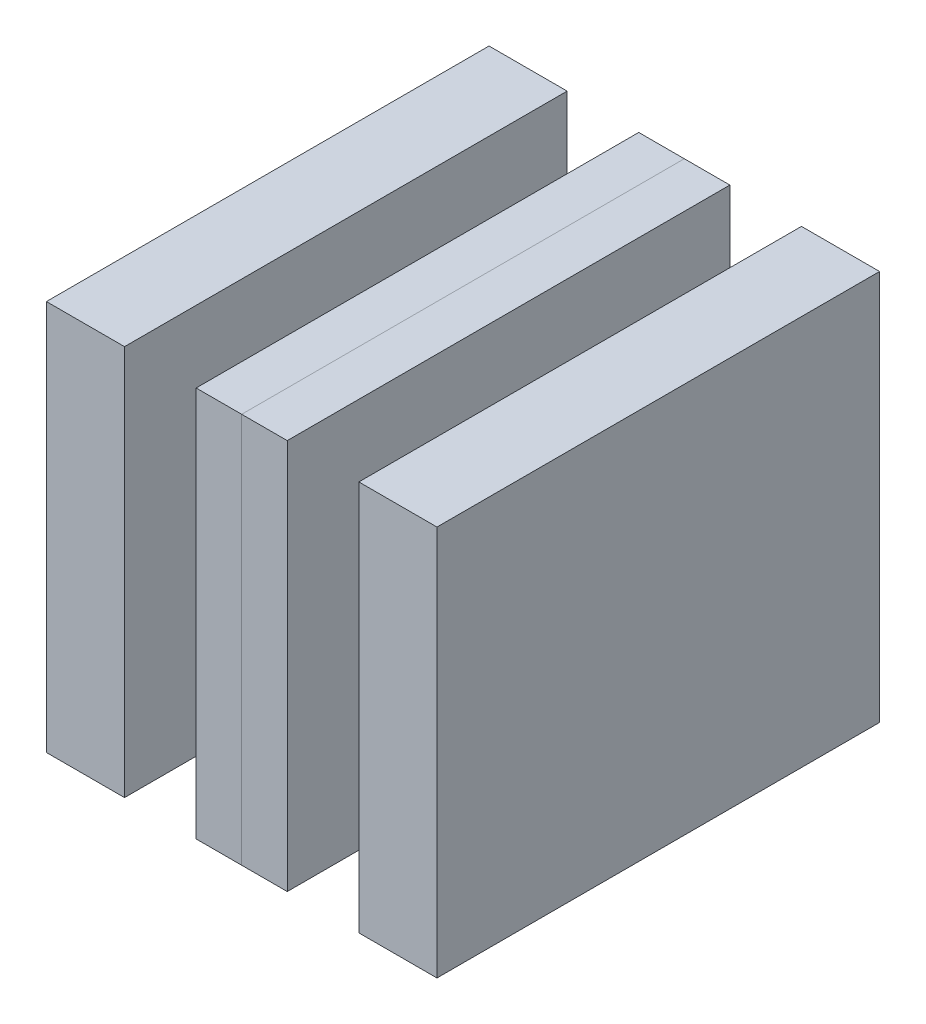
ISO-10303-21;
HEADER;
FILE_DESCRIPTION(('STEP AP214'),'2;1');
FILE_NAME('part.step','',(''),(''),'','','');
FILE_SCHEMA(('AUTOMOTIVE_DESIGN { 1 0 10303 214 1 1 1 1 }'));
ENDSEC;
DATA;
#1=APPLICATION_CONTEXT('core data for automotive mechanical design processes');
#2=APPLICATION_PROTOCOL_DEFINITION('international standard','automotive_design',2000,#1);
#3=PRODUCT_CONTEXT('',#1,'mechanical');
#4=PRODUCT('Part','Part','',(#3));
#5=PRODUCT_RELATED_PRODUCT_CATEGORY('part','',(#4));
#6=PRODUCT_DEFINITION_FORMATION('','',#4);
#7=PRODUCT_DEFINITION_CONTEXT('part definition',#1,'design');
#8=PRODUCT_DEFINITION('design','',#6,#7);
#9=PRODUCT_DEFINITION_SHAPE('','',#8);
#10=(LENGTH_UNIT() NAMED_UNIT(*) SI_UNIT(.MILLI.,.METRE.));
#11=(NAMED_UNIT(*) PLANE_ANGLE_UNIT() SI_UNIT($,.RADIAN.));
#12=(NAMED_UNIT(*) SI_UNIT($,.STERADIAN.) SOLID_ANGLE_UNIT());
#13=UNCERTAINTY_MEASURE_WITH_UNIT(LENGTH_MEASURE(1.E-05),#10,'distance_accuracy_value','');
#14=(GEOMETRIC_REPRESENTATION_CONTEXT(3) GLOBAL_UNCERTAINTY_ASSIGNED_CONTEXT((#13)) GLOBAL_UNIT_ASSIGNED_CONTEXT((#10,
#11,#12)) REPRESENTATION_CONTEXT('',''));
#15=CARTESIAN_POINT('',(0.,0.,0.));
#16=DIRECTION('',(0.,0.,1.));
#17=DIRECTION('',(1.,0.,0.));
#18=AXIS2_PLACEMENT_3D('',#15,#16,#17);
#19=CARTESIAN_POINT('',(15.,0.,17.));
#20=DIRECTION('',(-1.,0.,0.));
#21=DIRECTION('',(0.,0.,-1.));
#22=AXIS2_PLACEMENT_3D('',#19,#20,#21);
#23=PLANE('',#22);
#24=DIRECTION('',(0.,-1.,0.));
#25=VECTOR('',#24,1.);
#26=CARTESIAN_POINT('',(15.,0.,0.));
#27=LINE('',#26,#25);
#28=CARTESIAN_POINT('',(15.,15.,0.));
#29=VERTEX_POINT('',#28);
#30=CARTESIAN_POINT('',(15.,0.,0.));
#31=VERTEX_POINT('',#30);
#32=EDGE_CURVE('E107',#29,#31,#27,.T.);
#33=ORIENTED_EDGE('',*,*,#32,.F.);
#34=DIRECTION('',(0.,0.,-1.));
#35=VECTOR('',#34,1.);
#36=CARTESIAN_POINT('',(15.,15.,17.));
#37=LINE('',#36,#35);
#38=CARTESIAN_POINT('',(15.,15.,17.));
#39=VERTEX_POINT('',#38);
#40=EDGE_CURVE('E106',#39,#29,#37,.T.);
#41=ORIENTED_EDGE('',*,*,#40,.F.);
#42=DIRECTION('',(0.,-1.,0.));
#43=VECTOR('',#42,1.);
#44=CARTESIAN_POINT('',(15.,0.,17.));
#45=LINE('',#44,#43);
#46=CARTESIAN_POINT('',(15.,0.,17.));
#47=VERTEX_POINT('',#46);
#48=EDGE_CURVE('E101',#39,#47,#45,.T.);
#49=ORIENTED_EDGE('',*,*,#48,.T.);
#50=DIRECTION('',(0.,0.,-1.));
#51=VECTOR('',#50,1.);
#52=CARTESIAN_POINT('',(15.,0.,17.));
#53=LINE('',#52,#51);
#54=EDGE_CURVE('E12',#47,#31,#53,.T.);
#55=ORIENTED_EDGE('',*,*,#54,.T.);
#56=EDGE_LOOP('',(#33,#41,#49,#55));
#57=FACE_BOUND('',#56,.T.);
#58=ADVANCED_FACE('F44',(#57),#23,.F.);
#59=CARTESIAN_POINT('',(15.,0.,17.));
#60=DIRECTION('',(0.,1.,0.));
#61=DIRECTION('',(0.,0.,1.));
#62=AXIS2_PLACEMENT_3D('',#59,#60,#61);
#63=PLANE('',#62);
#64=DIRECTION('',(-1.,0.,0.));
#65=VECTOR('',#64,1.);
#66=CARTESIAN_POINT('',(15.,0.,0.));
#67=LINE('',#66,#65);
#68=CARTESIAN_POINT('',(12.,0.,0.));
#69=VERTEX_POINT('',#68);
#70=EDGE_CURVE('E109',#31,#69,#67,.T.);
#71=ORIENTED_EDGE('',*,*,#70,.F.);
#72=ORIENTED_EDGE('',*,*,#54,.F.);
#73=DIRECTION('',(-1.,0.,0.));
#74=VECTOR('',#73,1.);
#75=CARTESIAN_POINT('',(15.,0.,17.));
#76=LINE('',#75,#74);
#77=CARTESIAN_POINT('',(12.,0.,17.));
#78=VERTEX_POINT('',#77);
#79=EDGE_CURVE('E85',#47,#78,#76,.T.);
#80=ORIENTED_EDGE('',*,*,#79,.T.);
#81=DIRECTION('',(0.,0.,-1.));
#82=VECTOR('',#81,1.);
#83=CARTESIAN_POINT('',(12.,0.,17.));
#84=LINE('',#83,#82);
#85=EDGE_CURVE('E52',#78,#69,#84,.T.);
#86=ORIENTED_EDGE('',*,*,#85,.T.);
#87=EDGE_LOOP('',(#71,#72,#80,#86));
#88=FACE_BOUND('',#87,.T.);
#89=ADVANCED_FACE('F99',(#88),#63,.F.);
#90=CARTESIAN_POINT('',(12.,0.,17.));
#91=DIRECTION('',(1.,0.,0.));
#92=DIRECTION('',(0.,0.,1.));
#93=AXIS2_PLACEMENT_3D('',#90,#91,#92);
#94=PLANE('',#93);
#95=DIRECTION('',(0.,1.,0.));
#96=VECTOR('',#95,1.);
#97=CARTESIAN_POINT('',(12.,0.,0.));
#98=LINE('',#97,#96);
#99=CARTESIAN_POINT('',(12.,15.,0.));
#100=VERTEX_POINT('',#99);
#101=EDGE_CURVE('E95',#69,#100,#98,.T.);
#102=ORIENTED_EDGE('',*,*,#101,.F.);
#103=ORIENTED_EDGE('',*,*,#85,.F.);
#104=DIRECTION('',(0.,1.,0.));
#105=VECTOR('',#104,1.);
#106=CARTESIAN_POINT('',(12.,0.,17.));
#107=LINE('',#106,#105);
#108=CARTESIAN_POINT('',(12.,15.,17.));
#109=VERTEX_POINT('',#108);
#110=EDGE_CURVE('E88',#78,#109,#107,.T.);
#111=ORIENTED_EDGE('',*,*,#110,.T.);
#112=DIRECTION('',(0.,0.,-1.));
#113=VECTOR('',#112,1.);
#114=CARTESIAN_POINT('',(12.,15.,17.));
#115=LINE('',#114,#113);
#116=EDGE_CURVE('E98',#109,#100,#115,.T.);
#117=ORIENTED_EDGE('',*,*,#116,.T.);
#118=EDGE_LOOP('',(#102,#103,#111,#117));
#119=FACE_BOUND('',#118,.T.);
#120=ADVANCED_FACE('F94',(#119),#94,.F.);
#121=CARTESIAN_POINT('',(15.,15.,17.));
#122=DIRECTION('',(0.,-1.,0.));
#123=DIRECTION('',(0.,0.,-1.));
#124=AXIS2_PLACEMENT_3D('',#121,#122,#123);
#125=PLANE('',#124);
#126=DIRECTION('',(1.,0.,0.));
#127=VECTOR('',#126,1.);
#128=CARTESIAN_POINT('',(15.,15.,0.));
#129=LINE('',#128,#127);
#130=EDGE_CURVE('E74',#100,#29,#129,.T.);
#131=ORIENTED_EDGE('',*,*,#130,.F.);
#132=ORIENTED_EDGE('',*,*,#116,.F.);
#133=DIRECTION('',(1.,0.,0.));
#134=VECTOR('',#133,1.);
#135=CARTESIAN_POINT('',(15.,15.,17.));
#136=LINE('',#135,#134);
#137=EDGE_CURVE('E60',#109,#39,#136,.T.);
#138=ORIENTED_EDGE('',*,*,#137,.T.);
#139=ORIENTED_EDGE('',*,*,#40,.T.);
#140=EDGE_LOOP('',(#131,#132,#138,#139));
#141=FACE_BOUND('',#140,.T.);
#142=ADVANCED_FACE('F118',(#141),#125,.F.);
#143=CARTESIAN_POINT('',(15.,0.,17.));
#144=DIRECTION('',(0.,0.,-1.));
#145=DIRECTION('',(1.,0.,0.));
#146=AXIS2_PLACEMENT_3D('',#143,#144,#145);
#147=PLANE('',#146);
#148=ORIENTED_EDGE('',*,*,#48,.F.);
#149=ORIENTED_EDGE('',*,*,#137,.F.);
#150=ORIENTED_EDGE('',*,*,#110,.F.);
#151=ORIENTED_EDGE('',*,*,#79,.F.);
#152=EDGE_LOOP('',(#148,#149,#150,#151));
#153=FACE_BOUND('',#152,.T.);
#154=ADVANCED_FACE('F90',(#153),#147,.F.);
#155=CARTESIAN_POINT('',(15.,0.,0.));
#156=DIRECTION('',(0.,0.,-1.));
#157=DIRECTION('',(1.,0.,0.));
#158=AXIS2_PLACEMENT_3D('',#155,#156,#157);
#159=PLANE('',#158);
#160=ORIENTED_EDGE('',*,*,#32,.T.);
#161=ORIENTED_EDGE('',*,*,#70,.T.);
#162=ORIENTED_EDGE('',*,*,#101,.T.);
#163=ORIENTED_EDGE('',*,*,#130,.T.);
#164=EDGE_LOOP('',(#160,#161,#162,#163));
#165=FACE_BOUND('',#164,.T.);
#166=ADVANCED_FACE('F114',(#165),#159,.T.);
#167=CLOSED_SHELL('',(#58,#89,#120,#142,#154,#166));
#168=MANIFOLD_SOLID_BREP('B2',#167);
#169=CARTESIAN_POINT('',(9.25,15.,17.));
#170=DIRECTION('',(-1.,0.,0.));
#171=DIRECTION('',(0.,1.,0.));
#172=AXIS2_PLACEMENT_3D('',#169,#170,#171);
#173=PLANE('',#172);
#174=DIRECTION('',(0.,-1.,0.));
#175=VECTOR('',#174,1.);
#176=CARTESIAN_POINT('',(9.25,15.,0.));
#177=LINE('',#176,#175);
#178=CARTESIAN_POINT('',(9.25,15.,0.));
#179=VERTEX_POINT('',#178);
#180=CARTESIAN_POINT('',(9.25,0.,0.));
#181=VERTEX_POINT('',#180);
#182=EDGE_CURVE('E241',#179,#181,#177,.T.);
#183=ORIENTED_EDGE('',*,*,#182,.F.);
#184=DIRECTION('',(0.,0.,-1.));
#185=VECTOR('',#184,1.);
#186=CARTESIAN_POINT('',(9.25,15.,17.));
#187=LINE('',#186,#185);
#188=CARTESIAN_POINT('',(9.25,15.,17.));
#189=VERTEX_POINT('',#188);
#190=EDGE_CURVE('E240',#189,#179,#187,.T.);
#191=ORIENTED_EDGE('',*,*,#190,.F.);
#192=DIRECTION('',(0.,-1.,0.));
#193=VECTOR('',#192,1.);
#194=CARTESIAN_POINT('',(9.25,15.,17.));
#195=LINE('',#194,#193);
#196=CARTESIAN_POINT('',(9.25,0.,17.));
#197=VERTEX_POINT('',#196);
#198=EDGE_CURVE('E235',#189,#197,#195,.T.);
#199=ORIENTED_EDGE('',*,*,#198,.T.);
#200=DIRECTION('',(0.,0.,-1.));
#201=VECTOR('',#200,1.);
#202=CARTESIAN_POINT('',(9.25,0.,17.));
#203=LINE('',#202,#201);
#204=EDGE_CURVE('E42',#197,#181,#203,.T.);
#205=ORIENTED_EDGE('',*,*,#204,.T.);
#206=EDGE_LOOP('',(#183,#191,#199,#205));
#207=FACE_BOUND('',#206,.T.);
#208=ADVANCED_FACE('F178',(#207),#173,.F.);
#209=CARTESIAN_POINT('',(9.25,0.,17.));
#210=DIRECTION('',(0.,1.,0.));
#211=DIRECTION('',(0.,0.,1.));
#212=AXIS2_PLACEMENT_3D('',#209,#210,#211);
#213=PLANE('',#212);
#214=DIRECTION('',(-1.,0.,0.));
#215=VECTOR('',#214,1.);
#216=CARTESIAN_POINT('',(9.25,0.,0.));
#217=LINE('',#216,#215);
#218=CARTESIAN_POINT('',(7.5,0.,0.));
#219=VERTEX_POINT('',#218);
#220=EDGE_CURVE('E243',#181,#219,#217,.T.);
#221=ORIENTED_EDGE('',*,*,#220,.F.);
#222=ORIENTED_EDGE('',*,*,#204,.F.);
#223=DIRECTION('',(-1.,0.,0.));
#224=VECTOR('',#223,1.);
#225=CARTESIAN_POINT('',(9.25,0.,17.));
#226=LINE('',#225,#224);
#227=CARTESIAN_POINT('',(7.5,0.,17.));
#228=VERTEX_POINT('',#227);
#229=EDGE_CURVE('E219',#197,#228,#226,.T.);
#230=ORIENTED_EDGE('',*,*,#229,.T.);
#231=DIRECTION('',(0.,0.,-1.));
#232=VECTOR('',#231,1.);
#233=CARTESIAN_POINT('',(7.5,0.,17.));
#234=LINE('',#233,#232);
#235=EDGE_CURVE('E186',#228,#219,#234,.T.);
#236=ORIENTED_EDGE('',*,*,#235,.T.);
#237=EDGE_LOOP('',(#221,#222,#230,#236));
#238=FACE_BOUND('',#237,.T.);
#239=ADVANCED_FACE('F233',(#238),#213,.F.);
#240=CARTESIAN_POINT('',(7.5,15.,17.));
#241=DIRECTION('',(1.,0.,0.));
#242=DIRECTION('',(0.,-1.,0.));
#243=AXIS2_PLACEMENT_3D('',#240,#241,#242);
#244=PLANE('',#243);
#245=DIRECTION('',(0.,1.,0.));
#246=VECTOR('',#245,1.);
#247=CARTESIAN_POINT('',(7.5,15.,0.));
#248=LINE('',#247,#246);
#249=CARTESIAN_POINT('',(7.5,15.,0.));
#250=VERTEX_POINT('',#249);
#251=EDGE_CURVE('E229',#219,#250,#248,.T.);
#252=ORIENTED_EDGE('',*,*,#251,.F.);
#253=ORIENTED_EDGE('',*,*,#235,.F.);
#254=DIRECTION('',(0.,1.,0.));
#255=VECTOR('',#254,1.);
#256=CARTESIAN_POINT('',(7.5,15.,17.));
#257=LINE('',#256,#255);
#258=CARTESIAN_POINT('',(7.5,15.,17.));
#259=VERTEX_POINT('',#258);
#260=EDGE_CURVE('E222',#228,#259,#257,.T.);
#261=ORIENTED_EDGE('',*,*,#260,.T.);
#262=DIRECTION('',(0.,0.,-1.));
#263=VECTOR('',#262,1.);
#264=CARTESIAN_POINT('',(7.5,15.,17.));
#265=LINE('',#264,#263);
#266=EDGE_CURVE('E232',#259,#250,#265,.T.);
#267=ORIENTED_EDGE('',*,*,#266,.T.);
#268=EDGE_LOOP('',(#252,#253,#261,#267));
#269=FACE_BOUND('',#268,.T.);
#270=ADVANCED_FACE('F228',(#269),#244,.F.);
#271=CARTESIAN_POINT('',(9.25,15.,17.));
#272=DIRECTION('',(0.,-1.,0.));
#273=DIRECTION('',(0.,0.,-1.));
#274=AXIS2_PLACEMENT_3D('',#271,#272,#273);
#275=PLANE('',#274);
#276=DIRECTION('',(1.,0.,0.));
#277=VECTOR('',#276,1.);
#278=CARTESIAN_POINT('',(9.25,15.,0.));
#279=LINE('',#278,#277);
#280=EDGE_CURVE('E208',#250,#179,#279,.T.);
#281=ORIENTED_EDGE('',*,*,#280,.F.);
#282=ORIENTED_EDGE('',*,*,#266,.F.);
#283=DIRECTION('',(1.,0.,0.));
#284=VECTOR('',#283,1.);
#285=CARTESIAN_POINT('',(9.25,15.,17.));
#286=LINE('',#285,#284);
#287=EDGE_CURVE('E194',#259,#189,#286,.T.);
#288=ORIENTED_EDGE('',*,*,#287,.T.);
#289=ORIENTED_EDGE('',*,*,#190,.T.);
#290=EDGE_LOOP('',(#281,#282,#288,#289));
#291=FACE_BOUND('',#290,.T.);
#292=ADVANCED_FACE('F252',(#291),#275,.F.);
#293=CARTESIAN_POINT('',(15.,0.,17.));
#294=DIRECTION('',(0.,0.,1.));
#295=DIRECTION('',(-1.,0.,0.));
#296=AXIS2_PLACEMENT_3D('',#293,#294,#295);
#297=PLANE('',#296);
#298=ORIENTED_EDGE('',*,*,#198,.F.);
#299=ORIENTED_EDGE('',*,*,#287,.F.);
#300=ORIENTED_EDGE('',*,*,#260,.F.);
#301=ORIENTED_EDGE('',*,*,#229,.F.);
#302=EDGE_LOOP('',(#298,#299,#300,#301));
#303=FACE_BOUND('',#302,.T.);
#304=ADVANCED_FACE('F224',(#303),#297,.T.);
#305=CARTESIAN_POINT('',(15.,0.,0.));
#306=DIRECTION('',(0.,0.,1.));
#307=DIRECTION('',(-1.,0.,0.));
#308=AXIS2_PLACEMENT_3D('',#305,#306,#307);
#309=PLANE('',#308);
#310=ORIENTED_EDGE('',*,*,#182,.T.);
#311=ORIENTED_EDGE('',*,*,#220,.T.);
#312=ORIENTED_EDGE('',*,*,#251,.T.);
#313=ORIENTED_EDGE('',*,*,#280,.T.);
#314=EDGE_LOOP('',(#310,#311,#312,#313));
#315=FACE_BOUND('',#314,.T.);
#316=ADVANCED_FACE('F248',(#315),#309,.F.);
#317=CLOSED_SHELL('',(#208,#239,#270,#292,#304,#316));
#318=MANIFOLD_SOLID_BREP('B6',#317);
#319=CARTESIAN_POINT('',(5.75,15.,17.));
#320=DIRECTION('',(1.,0.,0.));
#321=DIRECTION('',(0.,1.,0.));
#322=AXIS2_PLACEMENT_3D('',#319,#320,#321);
#323=PLANE('',#322);
#324=DIRECTION('',(0.,-1.,0.));
#325=VECTOR('',#324,1.);
#326=CARTESIAN_POINT('',(5.75,15.,0.));
#327=LINE('',#326,#325);
#328=CARTESIAN_POINT('',(5.75,15.,0.));
#329=VERTEX_POINT('',#328);
#330=CARTESIAN_POINT('',(5.75,0.,0.));
#331=VERTEX_POINT('',#330);
#332=EDGE_CURVE('E374',#329,#331,#327,.T.);
#333=ORIENTED_EDGE('',*,*,#332,.T.);
#334=DIRECTION('',(0.,0.,-1.));
#335=VECTOR('',#334,1.);
#336=CARTESIAN_POINT('',(5.75,0.,17.));
#337=LINE('',#336,#335);
#338=CARTESIAN_POINT('',(5.75,0.,17.));
#339=VERTEX_POINT('',#338);
#340=EDGE_CURVE('E176',#339,#331,#337,.T.);
#341=ORIENTED_EDGE('',*,*,#340,.F.);
#342=DIRECTION('',(0.,-1.,0.));
#343=VECTOR('',#342,1.);
#344=CARTESIAN_POINT('',(5.75,15.,17.));
#345=LINE('',#344,#343);
#346=CARTESIAN_POINT('',(5.75,15.,17.));
#347=VERTEX_POINT('',#346);
#348=EDGE_CURVE('E362',#347,#339,#345,.T.);
#349=ORIENTED_EDGE('',*,*,#348,.F.);
#350=DIRECTION('',(0.,0.,-1.));
#351=VECTOR('',#350,1.);
#352=CARTESIAN_POINT('',(5.75,15.,17.));
#353=LINE('',#352,#351);
#354=EDGE_CURVE('E370',#347,#329,#353,.T.);
#355=ORIENTED_EDGE('',*,*,#354,.T.);
#356=EDGE_LOOP('',(#333,#341,#349,#355));
#357=FACE_BOUND('',#356,.T.);
#358=ADVANCED_FACE('F311',(#357),#323,.F.);
#359=CARTESIAN_POINT('',(5.75,0.,17.));
#360=DIRECTION('',(0.,1.,0.));
#361=DIRECTION('',(0.,0.,1.));
#362=AXIS2_PLACEMENT_3D('',#359,#360,#361);
#363=PLANE('',#362);
#364=DIRECTION('',(1.,0.,0.));
#365=VECTOR('',#364,1.);
#366=CARTESIAN_POINT('',(5.75,0.,0.));
#367=LINE('',#366,#365);
#368=CARTESIAN_POINT('',(7.5,0.,0.));
#369=VERTEX_POINT('',#368);
#370=EDGE_CURVE('E366',#331,#369,#367,.T.);
#371=ORIENTED_EDGE('',*,*,#370,.T.);
#372=DIRECTION('',(0.,0.,-1.));
#373=VECTOR('',#372,1.);
#374=CARTESIAN_POINT('',(7.5,0.,17.));
#375=LINE('',#374,#373);
#376=CARTESIAN_POINT('',(7.5,0.,17.));
#377=VERTEX_POINT('',#376);
#378=EDGE_CURVE('E319',#377,#369,#375,.T.);
#379=ORIENTED_EDGE('',*,*,#378,.F.);
#380=DIRECTION('',(1.,0.,0.));
#381=VECTOR('',#380,1.);
#382=CARTESIAN_POINT('',(5.75,0.,17.));
#383=LINE('',#382,#381);
#384=EDGE_CURVE('E357',#339,#377,#383,.T.);
#385=ORIENTED_EDGE('',*,*,#384,.F.);
#386=ORIENTED_EDGE('',*,*,#340,.T.);
#387=EDGE_LOOP('',(#371,#379,#385,#386));
#388=FACE_BOUND('',#387,.T.);
#389=ADVANCED_FACE('F365',(#388),#363,.F.);
#390=CARTESIAN_POINT('',(7.5,15.,17.));
#391=DIRECTION('',(-1.,0.,0.));
#392=DIRECTION('',(0.,-1.,0.));
#393=AXIS2_PLACEMENT_3D('',#390,#391,#392);
#394=PLANE('',#393);
#395=DIRECTION('',(0.,1.,0.));
#396=VECTOR('',#395,1.);
#397=CARTESIAN_POINT('',(7.5,15.,0.));
#398=LINE('',#397,#396);
#399=CARTESIAN_POINT('',(7.5,15.,0.));
#400=VERTEX_POINT('',#399);
#401=EDGE_CURVE('E344',#369,#400,#398,.T.);
#402=ORIENTED_EDGE('',*,*,#401,.T.);
#403=DIRECTION('',(0.,0.,-1.));
#404=VECTOR('',#403,1.);
#405=CARTESIAN_POINT('',(7.5,15.,17.));
#406=LINE('',#405,#404);
#407=CARTESIAN_POINT('',(7.5,15.,17.));
#408=VERTEX_POINT('',#407);
#409=EDGE_CURVE('E367',#408,#400,#406,.T.);
#410=ORIENTED_EDGE('',*,*,#409,.F.);
#411=DIRECTION('',(0.,1.,0.));
#412=VECTOR('',#411,1.);
#413=CARTESIAN_POINT('',(7.5,15.,17.));
#414=LINE('',#413,#412);
#415=EDGE_CURVE('E360',#377,#408,#414,.T.);
#416=ORIENTED_EDGE('',*,*,#415,.F.);
#417=ORIENTED_EDGE('',*,*,#378,.T.);
#418=EDGE_LOOP('',(#402,#410,#416,#417));
#419=FACE_BOUND('',#418,.T.);
#420=ADVANCED_FACE('F368',(#419),#394,.F.);
#421=CARTESIAN_POINT('',(5.75,15.,17.));
#422=DIRECTION('',(0.,-1.,0.));
#423=DIRECTION('',(0.,0.,-1.));
#424=AXIS2_PLACEMENT_3D('',#421,#422,#423);
#425=PLANE('',#424);
#426=DIRECTION('',(-1.,0.,0.));
#427=VECTOR('',#426,1.);
#428=CARTESIAN_POINT('',(5.75,15.,0.));
#429=LINE('',#428,#427);
#430=EDGE_CURVE('E350',#400,#329,#429,.T.);
#431=ORIENTED_EDGE('',*,*,#430,.T.);
#432=ORIENTED_EDGE('',*,*,#354,.F.);
#433=DIRECTION('',(-1.,0.,0.));
#434=VECTOR('',#433,1.);
#435=CARTESIAN_POINT('',(5.75,15.,17.));
#436=LINE('',#435,#434);
#437=EDGE_CURVE('E327',#408,#347,#436,.T.);
#438=ORIENTED_EDGE('',*,*,#437,.F.);
#439=ORIENTED_EDGE('',*,*,#409,.T.);
#440=EDGE_LOOP('',(#431,#432,#438,#439));
#441=FACE_BOUND('',#440,.T.);
#442=ADVANCED_FACE('F381',(#441),#425,.F.);
#443=CARTESIAN_POINT('',(0.,0.,17.));
#444=DIRECTION('',(0.,0.,1.));
#445=DIRECTION('',(1.,0.,0.));
#446=AXIS2_PLACEMENT_3D('',#443,#444,#445);
#447=PLANE('',#446);
#448=ORIENTED_EDGE('',*,*,#348,.T.);
#449=ORIENTED_EDGE('',*,*,#384,.T.);
#450=ORIENTED_EDGE('',*,*,#415,.T.);
#451=ORIENTED_EDGE('',*,*,#437,.T.);
#452=EDGE_LOOP('',(#448,#449,#450,#451));
#453=FACE_BOUND('',#452,.T.);
#454=ADVANCED_FACE('F358',(#453),#447,.T.);
#455=CARTESIAN_POINT('',(0.,0.,0.));
#456=DIRECTION('',(0.,0.,1.));
#457=DIRECTION('',(1.,0.,0.));
#458=AXIS2_PLACEMENT_3D('',#455,#456,#457);
#459=PLANE('',#458);
#460=ORIENTED_EDGE('',*,*,#332,.F.);
#461=ORIENTED_EDGE('',*,*,#430,.F.);
#462=ORIENTED_EDGE('',*,*,#401,.F.);
#463=ORIENTED_EDGE('',*,*,#370,.F.);
#464=EDGE_LOOP('',(#460,#461,#462,#463));
#465=FACE_BOUND('',#464,.T.);
#466=ADVANCED_FACE('F384',(#465),#459,.F.);
#467=CLOSED_SHELL('',(#358,#389,#420,#442,#454,#466));
#468=MANIFOLD_SOLID_BREP('B36',#467);
#469=CARTESIAN_POINT('',(0.,0.,17.));
#470=DIRECTION('',(1.,0.,0.));
#471=DIRECTION('',(0.,0.,-1.));
#472=AXIS2_PLACEMENT_3D('',#469,#470,#471);
#473=PLANE('',#472);
#474=DIRECTION('',(0.,-1.,0.));
#475=VECTOR('',#474,1.);
#476=CARTESIAN_POINT('',(0.,0.,0.));
#477=LINE('',#476,#475);
#478=CARTESIAN_POINT('',(0.,15.,0.));
#479=VERTEX_POINT('',#478);
#480=CARTESIAN_POINT('',(0.,0.,0.));
#481=VERTEX_POINT('',#480);
#482=EDGE_CURVE('E498',#479,#481,#477,.T.);
#483=ORIENTED_EDGE('',*,*,#482,.T.);
#484=DIRECTION('',(0.,0.,-1.));
#485=VECTOR('',#484,1.);
#486=CARTESIAN_POINT('',(0.,0.,17.));
#487=LINE('',#486,#485);
#488=CARTESIAN_POINT('',(0.,0.,17.));
#489=VERTEX_POINT('',#488);
#490=EDGE_CURVE('E309',#489,#481,#487,.T.);
#491=ORIENTED_EDGE('',*,*,#490,.F.);
#492=DIRECTION('',(0.,-1.,0.));
#493=VECTOR('',#492,1.);
#494=CARTESIAN_POINT('',(0.,0.,17.));
#495=LINE('',#494,#493);
#496=CARTESIAN_POINT('',(0.,15.,17.));
#497=VERTEX_POINT('',#496);
#498=EDGE_CURVE('E486',#497,#489,#495,.T.);
#499=ORIENTED_EDGE('',*,*,#498,.F.);
#500=DIRECTION('',(0.,0.,-1.));
#501=VECTOR('',#500,1.);
#502=CARTESIAN_POINT('',(0.,15.,17.));
#503=LINE('',#502,#501);
#504=EDGE_CURVE('E494',#497,#479,#503,.T.);
#505=ORIENTED_EDGE('',*,*,#504,.T.);
#506=EDGE_LOOP('',(#483,#491,#499,#505));
#507=FACE_BOUND('',#506,.T.);
#508=ADVANCED_FACE('F435',(#507),#473,.F.);
#509=CARTESIAN_POINT('',(0.,0.,17.));
#510=DIRECTION('',(0.,1.,0.));
#511=DIRECTION('',(0.,0.,1.));
#512=AXIS2_PLACEMENT_3D('',#509,#510,#511);
#513=PLANE('',#512);
#514=DIRECTION('',(1.,0.,0.));
#515=VECTOR('',#514,1.);
#516=CARTESIAN_POINT('',(0.,0.,0.));
#517=LINE('',#516,#515);
#518=CARTESIAN_POINT('',(3.,0.,0.));
#519=VERTEX_POINT('',#518);
#520=EDGE_CURVE('E490',#481,#519,#517,.T.);
#521=ORIENTED_EDGE('',*,*,#520,.T.);
#522=DIRECTION('',(0.,0.,-1.));
#523=VECTOR('',#522,1.);
#524=CARTESIAN_POINT('',(3.,0.,17.));
#525=LINE('',#524,#523);
#526=CARTESIAN_POINT('',(3.,0.,17.));
#527=VERTEX_POINT('',#526);
#528=EDGE_CURVE('E443',#527,#519,#525,.T.);
#529=ORIENTED_EDGE('',*,*,#528,.F.);
#530=DIRECTION('',(1.,0.,0.));
#531=VECTOR('',#530,1.);
#532=CARTESIAN_POINT('',(0.,0.,17.));
#533=LINE('',#532,#531);
#534=EDGE_CURVE('E481',#489,#527,#533,.T.);
#535=ORIENTED_EDGE('',*,*,#534,.F.);
#536=ORIENTED_EDGE('',*,*,#490,.T.);
#537=EDGE_LOOP('',(#521,#529,#535,#536));
#538=FACE_BOUND('',#537,.T.);
#539=ADVANCED_FACE('F489',(#538),#513,.F.);
#540=CARTESIAN_POINT('',(3.,0.,17.));
#541=DIRECTION('',(-1.,0.,0.));
#542=DIRECTION('',(0.,0.,1.));
#543=AXIS2_PLACEMENT_3D('',#540,#541,#542);
#544=PLANE('',#543);
#545=DIRECTION('',(0.,1.,0.));
#546=VECTOR('',#545,1.);
#547=CARTESIAN_POINT('',(3.,0.,0.));
#548=LINE('',#547,#546);
#549=CARTESIAN_POINT('',(3.,15.,0.));
#550=VERTEX_POINT('',#549);
#551=EDGE_CURVE('E468',#519,#550,#548,.T.);
#552=ORIENTED_EDGE('',*,*,#551,.T.);
#553=DIRECTION('',(0.,0.,-1.));
#554=VECTOR('',#553,1.);
#555=CARTESIAN_POINT('',(3.,15.,17.));
#556=LINE('',#555,#554);
#557=CARTESIAN_POINT('',(3.,15.,17.));
#558=VERTEX_POINT('',#557);
#559=EDGE_CURVE('E491',#558,#550,#556,.T.);
#560=ORIENTED_EDGE('',*,*,#559,.F.);
#561=DIRECTION('',(0.,1.,0.));
#562=VECTOR('',#561,1.);
#563=CARTESIAN_POINT('',(3.,0.,17.));
#564=LINE('',#563,#562);
#565=EDGE_CURVE('E484',#527,#558,#564,.T.);
#566=ORIENTED_EDGE('',*,*,#565,.F.);
#567=ORIENTED_EDGE('',*,*,#528,.T.);
#568=EDGE_LOOP('',(#552,#560,#566,#567));
#569=FACE_BOUND('',#568,.T.);
#570=ADVANCED_FACE('F492',(#569),#544,.F.);
#571=CARTESIAN_POINT('',(0.,15.,17.));
#572=DIRECTION('',(0.,-1.,0.));
#573=DIRECTION('',(0.,0.,-1.));
#574=AXIS2_PLACEMENT_3D('',#571,#572,#573);
#575=PLANE('',#574);
#576=DIRECTION('',(-1.,0.,0.));
#577=VECTOR('',#576,1.);
#578=CARTESIAN_POINT('',(0.,15.,0.));
#579=LINE('',#578,#577);
#580=EDGE_CURVE('E474',#550,#479,#579,.T.);
#581=ORIENTED_EDGE('',*,*,#580,.T.);
#582=ORIENTED_EDGE('',*,*,#504,.F.);
#583=DIRECTION('',(-1.,0.,0.));
#584=VECTOR('',#583,1.);
#585=CARTESIAN_POINT('',(0.,15.,17.));
#586=LINE('',#585,#584);
#587=EDGE_CURVE('E451',#558,#497,#586,.T.);
#588=ORIENTED_EDGE('',*,*,#587,.F.);
#589=ORIENTED_EDGE('',*,*,#559,.T.);
#590=EDGE_LOOP('',(#581,#582,#588,#589));
#591=FACE_BOUND('',#590,.T.);
#592=ADVANCED_FACE('F505',(#591),#575,.F.);
#593=CARTESIAN_POINT('',(0.,0.,17.));
#594=DIRECTION('',(0.,0.,-1.));
#595=DIRECTION('',(-1.,0.,0.));
#596=AXIS2_PLACEMENT_3D('',#593,#594,#595);
#597=PLANE('',#596);
#598=ORIENTED_EDGE('',*,*,#498,.T.);
#599=ORIENTED_EDGE('',*,*,#534,.T.);
#600=ORIENTED_EDGE('',*,*,#565,.T.);
#601=ORIENTED_EDGE('',*,*,#587,.T.);
#602=EDGE_LOOP('',(#598,#599,#600,#601));
#603=FACE_BOUND('',#602,.T.);
#604=ADVANCED_FACE('F482',(#603),#597,.F.);
#605=CARTESIAN_POINT('',(0.,0.,0.));
#606=DIRECTION('',(0.,0.,-1.));
#607=DIRECTION('',(-1.,0.,0.));
#608=AXIS2_PLACEMENT_3D('',#605,#606,#607);
#609=PLANE('',#608);
#610=ORIENTED_EDGE('',*,*,#482,.F.);
#611=ORIENTED_EDGE('',*,*,#580,.F.);
#612=ORIENTED_EDGE('',*,*,#551,.F.);
#613=ORIENTED_EDGE('',*,*,#520,.F.);
#614=EDGE_LOOP('',(#610,#611,#612,#613));
#615=FACE_BOUND('',#614,.T.);
#616=ADVANCED_FACE('F508',(#615),#609,.T.);
#617=CLOSED_SHELL('',(#508,#539,#570,#592,#604,#616));
#618=MANIFOLD_SOLID_BREP('B170',#617);
#619=ADVANCED_BREP_SHAPE_REPRESENTATION('',(#18,#168,#318,#468,#618),#14);
#620=SHAPE_DEFINITION_REPRESENTATION(#9,#619);
ENDSEC;
END-ISO-10303-21;
